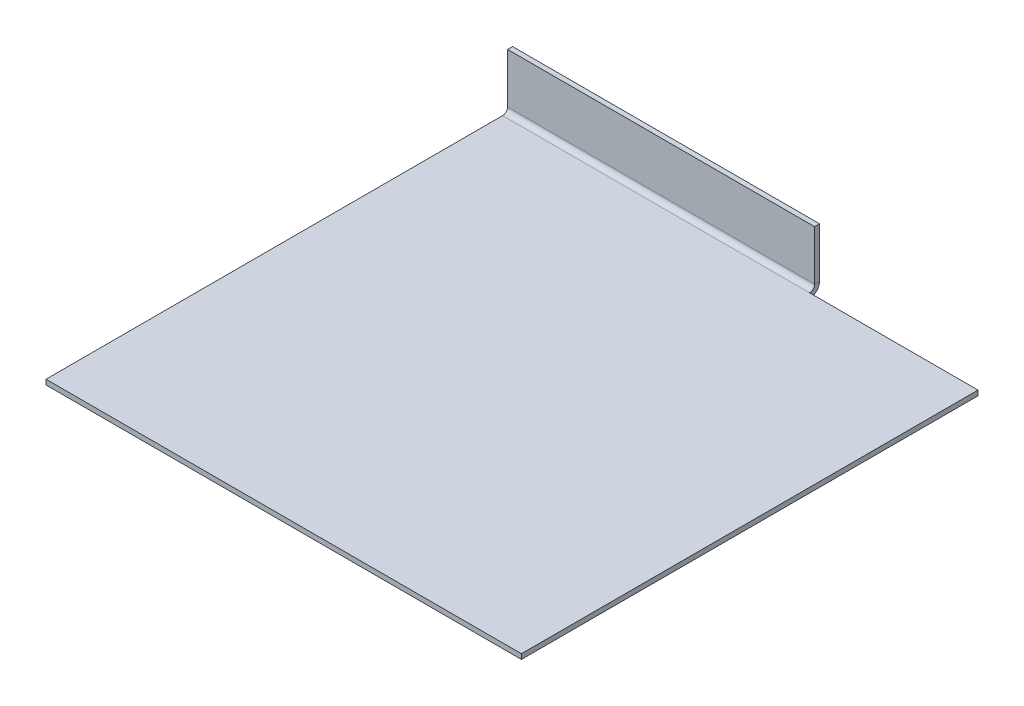
ISO-10303-21;
HEADER;
FILE_DESCRIPTION(('STEP AP214'),'2;1');
FILE_NAME('part.step','',(''),(''),'','','');
FILE_SCHEMA(('AUTOMOTIVE_DESIGN { 1 0 10303 214 1 1 1 1 }'));
ENDSEC;
DATA;
#1=APPLICATION_CONTEXT('core data for automotive mechanical design processes');
#2=APPLICATION_PROTOCOL_DEFINITION('international standard','automotive_design',2000,#1);
#3=PRODUCT_CONTEXT('',#1,'mechanical');
#4=PRODUCT('Part','Part','',(#3));
#5=PRODUCT_RELATED_PRODUCT_CATEGORY('part','',(#4));
#6=PRODUCT_DEFINITION_FORMATION('','',#4);
#7=PRODUCT_DEFINITION_CONTEXT('part definition',#1,'design');
#8=PRODUCT_DEFINITION('design','',#6,#7);
#9=PRODUCT_DEFINITION_SHAPE('','',#8);
#10=(LENGTH_UNIT() NAMED_UNIT(*) SI_UNIT(.MILLI.,.METRE.));
#11=(NAMED_UNIT(*) PLANE_ANGLE_UNIT() SI_UNIT($,.RADIAN.));
#12=(NAMED_UNIT(*) SI_UNIT($,.STERADIAN.) SOLID_ANGLE_UNIT());
#13=UNCERTAINTY_MEASURE_WITH_UNIT(LENGTH_MEASURE(1.E-05),#10,'distance_accuracy_value','');
#14=(GEOMETRIC_REPRESENTATION_CONTEXT(3) GLOBAL_UNCERTAINTY_ASSIGNED_CONTEXT((#13)) GLOBAL_UNIT_ASSIGNED_CONTEXT((#10,
#11,#12)) REPRESENTATION_CONTEXT('',''));
#15=CARTESIAN_POINT('',(0.,0.,0.));
#16=DIRECTION('',(0.,0.,1.));
#17=DIRECTION('',(1.,0.,0.));
#18=AXIS2_PLACEMENT_3D('',#15,#16,#17);
#19=CARTESIAN_POINT('',(-101.6,-3.175,-290.83));
#20=DIRECTION('',(-1.,0.,0.));
#21=DIRECTION('',(0.,0.,1.));
#22=AXIS2_PLACEMENT_3D('',#19,#20,#21);
#23=PLANE('',#22);
#24=DIRECTION('',(0.,0.,1.));
#25=VECTOR('',#24,1.);
#26=CARTESIAN_POINT('',(-101.6,0.,-290.83));
#27=LINE('',#26,#25);
#28=CARTESIAN_POINT('',(-101.6,0.,-290.83));
#29=VERTEX_POINT('',#28);
#30=CARTESIAN_POINT('',(-101.6,0.,0.));
#31=VERTEX_POINT('',#30);
#32=EDGE_CURVE('E196',#29,#31,#27,.T.);
#33=ORIENTED_EDGE('',*,*,#32,.F.);
#34=DIRECTION('',(0.,1.,0.));
#35=VECTOR('',#34,1.);
#36=CARTESIAN_POINT('',(-101.6,-3.175,-290.83));
#37=LINE('',#36,#35);
#38=CARTESIAN_POINT('',(-101.6,-3.175,-290.83));
#39=VERTEX_POINT('',#38);
#40=EDGE_CURVE('E67',#39,#29,#37,.T.);
#41=ORIENTED_EDGE('',*,*,#40,.F.);
#42=DIRECTION('',(0.,0.,1.));
#43=VECTOR('',#42,1.);
#44=CARTESIAN_POINT('',(-101.6,-3.175,-290.83));
#45=LINE('',#44,#43);
#46=CARTESIAN_POINT('',(-101.6,-3.175,0.));
#47=VERTEX_POINT('',#46);
#48=EDGE_CURVE('E201',#39,#47,#45,.T.);
#49=ORIENTED_EDGE('',*,*,#48,.T.);
#50=DIRECTION('',(0.,1.,0.));
#51=VECTOR('',#50,1.);
#52=CARTESIAN_POINT('',(-101.6,-3.175,0.));
#53=LINE('',#52,#51);
#54=EDGE_CURVE('E13',#47,#31,#53,.T.);
#55=ORIENTED_EDGE('',*,*,#54,.T.);
#56=EDGE_LOOP('',(#33,#41,#49,#55));
#57=FACE_BOUND('',#56,.T.);
#58=ADVANCED_FACE('F58',(#57),#23,.T.);
#59=CARTESIAN_POINT('',(0.,-3.175,-290.83));
#60=DIRECTION('',(0.,0.,-1.));
#61=DIRECTION('',(-1.,0.,0.));
#62=AXIS2_PLACEMENT_3D('',#59,#60,#61);
#63=PLANE('',#62);
#64=DIRECTION('',(0.,-1.,0.));
#65=VECTOR('',#64,1.);
#66=CARTESIAN_POINT('',(93.921520056,0.,-290.83));
#67=LINE('',#66,#65);
#68=CARTESIAN_POINT('',(93.921520056,0.,-290.83));
#69=VERTEX_POINT('',#68);
#70=CARTESIAN_POINT('',(93.921520056,-3.17500000000002,-290.83));
#71=VERTEX_POINT('',#70);
#72=EDGE_CURVE('E75',#69,#71,#67,.T.);
#73=ORIENTED_EDGE('',*,*,#72,.F.);
#74=DIRECTION('',(-1.,0.,0.));
#75=VECTOR('',#74,1.);
#76=CARTESIAN_POINT('',(0.,0.,-290.83));
#77=LINE('',#76,#75);
#78=CARTESIAN_POINT('',(201.20864,0.,-290.83));
#79=VERTEX_POINT('',#78);
#80=EDGE_CURVE('E208',#79,#69,#77,.T.);
#81=ORIENTED_EDGE('',*,*,#80,.F.);
#82=DIRECTION('',(0.,1.,0.));
#83=VECTOR('',#82,1.);
#84=CARTESIAN_POINT('',(201.20864,-3.175,-290.83));
#85=LINE('',#84,#83);
#86=CARTESIAN_POINT('',(201.20864,-3.175,-290.83));
#87=VERTEX_POINT('',#86);
#88=EDGE_CURVE('E213',#87,#79,#85,.T.);
#89=ORIENTED_EDGE('',*,*,#88,.F.);
#90=DIRECTION('',(-1.,0.,0.));
#91=VECTOR('',#90,1.);
#92=CARTESIAN_POINT('',(0.,-3.175,-290.83));
#93=LINE('',#92,#91);
#94=EDGE_CURVE('E199',#87,#71,#93,.T.);
#95=ORIENTED_EDGE('',*,*,#94,.T.);
#96=EDGE_LOOP('',(#73,#81,#89,#95));
#97=FACE_BOUND('',#96,.T.);
#98=ADVANCED_FACE('F254',(#97),#63,.T.);
#99=CARTESIAN_POINT('',(201.20864,-3.175,0.));
#100=DIRECTION('',(1.,0.,0.));
#101=DIRECTION('',(0.,0.,-1.));
#102=AXIS2_PLACEMENT_3D('',#99,#100,#101);
#103=PLANE('',#102);
#104=DIRECTION('',(0.,0.,-1.));
#105=VECTOR('',#104,1.);
#106=CARTESIAN_POINT('',(201.20864,0.,0.));
#107=LINE('',#106,#105);
#108=CARTESIAN_POINT('',(201.20864,0.,0.));
#109=VERTEX_POINT('',#108);
#110=EDGE_CURVE('E205',#109,#79,#107,.T.);
#111=ORIENTED_EDGE('',*,*,#110,.F.);
#112=DIRECTION('',(0.,1.,0.));
#113=VECTOR('',#112,1.);
#114=CARTESIAN_POINT('',(201.20864,-3.175,0.));
#115=LINE('',#114,#113);
#116=CARTESIAN_POINT('',(201.20864,-3.175,0.));
#117=VERTEX_POINT('',#116);
#118=EDGE_CURVE('E62',#117,#109,#115,.T.);
#119=ORIENTED_EDGE('',*,*,#118,.F.);
#120=DIRECTION('',(0.,0.,-1.));
#121=VECTOR('',#120,1.);
#122=CARTESIAN_POINT('',(201.20864,-3.175,0.));
#123=LINE('',#122,#121);
#124=EDGE_CURVE('E195',#117,#87,#123,.T.);
#125=ORIENTED_EDGE('',*,*,#124,.T.);
#126=ORIENTED_EDGE('',*,*,#88,.T.);
#127=EDGE_LOOP('',(#111,#119,#125,#126));
#128=FACE_BOUND('',#127,.T.);
#129=ADVANCED_FACE('F218',(#128),#103,.T.);
#130=CARTESIAN_POINT('',(0.,-3.175,0.));
#131=DIRECTION('',(0.,0.,1.));
#132=DIRECTION('',(1.,0.,0.));
#133=AXIS2_PLACEMENT_3D('',#130,#131,#132);
#134=PLANE('',#133);
#135=DIRECTION('',(1.,0.,0.));
#136=VECTOR('',#135,1.);
#137=CARTESIAN_POINT('',(0.,0.,0.));
#138=LINE('',#137,#136);
#139=EDGE_CURVE('E100',#31,#109,#138,.T.);
#140=ORIENTED_EDGE('',*,*,#139,.F.);
#141=ORIENTED_EDGE('',*,*,#54,.F.);
#142=DIRECTION('',(1.,0.,0.));
#143=VECTOR('',#142,1.);
#144=CARTESIAN_POINT('',(-101.6,-3.175,0.));
#145=LINE('',#144,#143);
#146=EDGE_CURVE('E102',#47,#117,#145,.T.);
#147=ORIENTED_EDGE('',*,*,#146,.T.);
#148=ORIENTED_EDGE('',*,*,#118,.T.);
#149=EDGE_LOOP('',(#140,#141,#147,#148));
#150=FACE_BOUND('',#149,.T.);
#151=ADVANCED_FACE('F60',(#150),#134,.T.);
#152=CARTESIAN_POINT('',(0.,-3.175,0.));
#153=DIRECTION('',(0.,1.,0.));
#154=DIRECTION('',(0.,0.,1.));
#155=AXIS2_PLACEMENT_3D('',#152,#153,#154);
#156=PLANE('',#155);
#157=ORIENTED_EDGE('',*,*,#146,.F.);
#158=ORIENTED_EDGE('',*,*,#48,.F.);
#159=DIRECTION('',(-1.,0.,0.));
#160=VECTOR('',#159,1.);
#161=CARTESIAN_POINT('',(-101.6,-3.17500000000002,-290.83));
#162=LINE('',#161,#160);
#163=EDGE_CURVE('E175',#39,#71,#162,.F.);
#164=ORIENTED_EDGE('',*,*,#163,.T.);
#165=ORIENTED_EDGE('',*,*,#94,.F.);
#166=ORIENTED_EDGE('',*,*,#124,.F.);
#167=EDGE_LOOP('',(#157,#158,#164,#165,#166));
#168=FACE_BOUND('',#167,.T.);
#169=ADVANCED_FACE('F250',(#168),#156,.F.);
#170=CARTESIAN_POINT('',(0.,0.,0.));
#171=DIRECTION('',(0.,1.,0.));
#172=DIRECTION('',(0.,0.,1.));
#173=AXIS2_PLACEMENT_3D('',#170,#171,#172);
#174=PLANE('',#173);
#175=ORIENTED_EDGE('',*,*,#32,.T.);
#176=ORIENTED_EDGE('',*,*,#139,.T.);
#177=ORIENTED_EDGE('',*,*,#110,.T.);
#178=ORIENTED_EDGE('',*,*,#80,.T.);
#179=DIRECTION('',(-1.,0.,0.));
#180=VECTOR('',#179,1.);
#181=CARTESIAN_POINT('',(-101.6,0.,-290.83));
#182=LINE('',#181,#180);
#183=EDGE_CURVE('E187',#29,#69,#182,.F.);
#184=ORIENTED_EDGE('',*,*,#183,.F.);
#185=EDGE_LOOP('',(#175,#176,#177,#178,#184));
#186=FACE_BOUND('',#185,.T.);
#187=ADVANCED_FACE('F220',(#186),#174,.T.);
#188=CARTESIAN_POINT('',(93.921520056,3.17499999999996,-290.83));
#189=DIRECTION('',(1.,0.,0.));
#190=DIRECTION('',(0.,0.,-1.));
#191=AXIS2_PLACEMENT_3D('',#188,#189,#190);
#192=PLANE('',#191);
#193=DIRECTION('',(0.,0.,1.));
#194=VECTOR('',#193,1.);
#195=CARTESIAN_POINT('',(93.921520056,3.175,-297.18));
#196=LINE('',#195,#194);
#197=CARTESIAN_POINT('',(93.921520056,3.17499999999995,-294.005));
#198=VERTEX_POINT('',#197);
#199=CARTESIAN_POINT('',(93.921520056,3.17499999999994,-297.18));
#200=VERTEX_POINT('',#199);
#201=EDGE_CURVE('E157',#198,#200,#196,.F.);
#202=ORIENTED_EDGE('',*,*,#201,.F.);
#203=CARTESIAN_POINT('',(93.921520056,3.17499999999996,-290.83));
#204=DIRECTION('',(-1.,0.,0.));
#205=DIRECTION('',(0.,0.,1.));
#206=AXIS2_PLACEMENT_3D('',#203,#204,#205);
#207=CIRCLE('',#206,3.17499999999998);
#208=EDGE_CURVE('E184',#69,#198,#207,.F.);
#209=ORIENTED_EDGE('',*,*,#208,.F.);
#210=ORIENTED_EDGE('',*,*,#72,.T.);
#211=CARTESIAN_POINT('',(93.921520056,3.17499999999996,-290.83));
#212=DIRECTION('',(-1.,0.,0.));
#213=DIRECTION('',(0.,0.,1.));
#214=AXIS2_PLACEMENT_3D('',#211,#212,#213);
#215=CIRCLE('',#214,6.34999999999998);
#216=EDGE_CURVE('E178',#71,#200,#215,.F.);
#217=ORIENTED_EDGE('',*,*,#216,.T.);
#218=EDGE_LOOP('',(#202,#209,#210,#217));
#219=FACE_BOUND('',#218,.T.);
#220=ADVANCED_FACE('F242',(#219),#192,.T.);
#221=CARTESIAN_POINT('',(-101.6,3.17499999999996,-290.83));
#222=DIRECTION('',(1.,0.,0.));
#223=DIRECTION('',(0.,0.,-1.));
#224=AXIS2_PLACEMENT_3D('',#221,#222,#223);
#225=PLANE('',#224);
#226=CARTESIAN_POINT('',(-101.6,3.17499999999996,-290.83));
#227=DIRECTION('',(-1.,0.,0.));
#228=DIRECTION('',(0.,0.,1.));
#229=AXIS2_PLACEMENT_3D('',#226,#227,#228);
#230=CIRCLE('',#229,3.17499999999998);
#231=CARTESIAN_POINT('',(-101.6,3.17499999999995,-294.005));
#232=VERTEX_POINT('',#231);
#233=EDGE_CURVE('E190',#232,#29,#230,.T.);
#234=ORIENTED_EDGE('',*,*,#233,.F.);
#235=DIRECTION('',(0.,0.,1.));
#236=VECTOR('',#235,1.);
#237=CARTESIAN_POINT('',(-101.6,3.17499999999998,-294.005));
#238=LINE('',#237,#236);
#239=CARTESIAN_POINT('',(-101.6,3.17500000000001,-297.18));
#240=VERTEX_POINT('',#239);
#241=EDGE_CURVE('E169',#232,#240,#238,.F.);
#242=ORIENTED_EDGE('',*,*,#241,.T.);
#243=CARTESIAN_POINT('',(-101.6,3.17499999999996,-290.83));
#244=DIRECTION('',(-1.,0.,0.));
#245=DIRECTION('',(0.,0.,1.));
#246=AXIS2_PLACEMENT_3D('',#243,#244,#245);
#247=CIRCLE('',#246,6.34999999999998);
#248=EDGE_CURVE('E179',#240,#39,#247,.T.);
#249=ORIENTED_EDGE('',*,*,#248,.T.);
#250=ORIENTED_EDGE('',*,*,#40,.T.);
#251=EDGE_LOOP('',(#234,#242,#249,#250));
#252=FACE_BOUND('',#251,.T.);
#253=ADVANCED_FACE('F226',(#252),#225,.F.);
#254=CARTESIAN_POINT('',(-101.6,3.17499999999996,-290.83));
#255=DIRECTION('',(-1.,0.,0.));
#256=DIRECTION('',(0.,0.,-1.));
#257=AXIS2_PLACEMENT_3D('',#254,#255,#256);
#258=CYLINDRICAL_SURFACE('',#257,6.34999999999998);
#259=ORIENTED_EDGE('',*,*,#163,.F.);
#260=ORIENTED_EDGE('',*,*,#248,.F.);
#261=DIRECTION('',(-1.,0.,0.));
#262=VECTOR('',#261,1.);
#263=CARTESIAN_POINT('',(93.921520056,3.17500000000001,-297.18));
#264=LINE('',#263,#262);
#265=EDGE_CURVE('E167',#240,#200,#264,.F.);
#266=ORIENTED_EDGE('',*,*,#265,.T.);
#267=ORIENTED_EDGE('',*,*,#216,.F.);
#268=EDGE_LOOP('',(#259,#260,#266,#267));
#269=FACE_BOUND('',#268,.T.);
#270=ADVANCED_FACE('F240',(#269),#258,.T.);
#271=CARTESIAN_POINT('',(-101.6,3.17499999999996,-290.83));
#272=DIRECTION('',(-1.,0.,0.));
#273=DIRECTION('',(0.,0.,-1.));
#274=AXIS2_PLACEMENT_3D('',#271,#272,#273);
#275=CYLINDRICAL_SURFACE('',#274,3.17499999999998);
#276=ORIENTED_EDGE('',*,*,#183,.T.);
#277=ORIENTED_EDGE('',*,*,#208,.T.);
#278=DIRECTION('',(-1.,0.,0.));
#279=VECTOR('',#278,1.);
#280=CARTESIAN_POINT('',(93.921520056,3.17499999999998,-294.005));
#281=LINE('',#280,#279);
#282=EDGE_CURVE('E172',#198,#232,#281,.T.);
#283=ORIENTED_EDGE('',*,*,#282,.T.);
#284=ORIENTED_EDGE('',*,*,#233,.T.);
#285=EDGE_LOOP('',(#276,#277,#283,#284));
#286=FACE_BOUND('',#285,.T.);
#287=ADVANCED_FACE('F229',(#286),#275,.F.);
#288=CARTESIAN_POINT('',(-101.6,34.925,-297.18));
#289=DIRECTION('',(1.,0.,0.));
#290=DIRECTION('',(0.,0.,-1.));
#291=AXIS2_PLACEMENT_3D('',#288,#289,#290);
#292=PLANE('',#291);
#293=ORIENTED_EDGE('',*,*,#241,.F.);
#294=DIRECTION('',(0.,-1.,0.));
#295=VECTOR('',#294,1.);
#296=CARTESIAN_POINT('',(-101.6,34.925,-294.005));
#297=LINE('',#296,#295);
#298=CARTESIAN_POINT('',(-101.6,34.925,-294.005));
#299=VERTEX_POINT('',#298);
#300=EDGE_CURVE('E165',#232,#299,#297,.F.);
#301=ORIENTED_EDGE('',*,*,#300,.T.);
#302=DIRECTION('',(0.,0.,1.));
#303=VECTOR('',#302,1.);
#304=CARTESIAN_POINT('',(-101.6,34.925,-297.18));
#305=LINE('',#304,#303);
#306=CARTESIAN_POINT('',(-101.6,34.925,-297.18));
#307=VERTEX_POINT('',#306);
#308=EDGE_CURVE('E153',#307,#299,#305,.T.);
#309=ORIENTED_EDGE('',*,*,#308,.F.);
#310=DIRECTION('',(0.,1.,0.));
#311=VECTOR('',#310,1.);
#312=CARTESIAN_POINT('',(-101.6,-9.35598444665957E-13,-297.18));
#313=LINE('',#312,#311);
#314=EDGE_CURVE('E140',#240,#307,#313,.T.);
#315=ORIENTED_EDGE('',*,*,#314,.F.);
#316=EDGE_LOOP('',(#293,#301,#309,#315));
#317=FACE_BOUND('',#316,.T.);
#318=ADVANCED_FACE('F236',(#317),#292,.F.);
#319=CARTESIAN_POINT('',(93.921520056,34.925,-297.18));
#320=DIRECTION('',(-1.,0.,0.));
#321=DIRECTION('',(0.,0.,1.));
#322=AXIS2_PLACEMENT_3D('',#319,#320,#321);
#323=PLANE('',#322);
#324=ORIENTED_EDGE('',*,*,#201,.T.);
#325=DIRECTION('',(0.,-1.,0.));
#326=VECTOR('',#325,1.);
#327=CARTESIAN_POINT('',(93.921520056,-9.35598444665957E-13,-297.18));
#328=LINE('',#327,#326);
#329=CARTESIAN_POINT('',(93.921520056,34.925,-297.18));
#330=VERTEX_POINT('',#329);
#331=EDGE_CURVE('E138',#330,#200,#328,.T.);
#332=ORIENTED_EDGE('',*,*,#331,.F.);
#333=DIRECTION('',(0.,0.,1.));
#334=VECTOR('',#333,1.);
#335=CARTESIAN_POINT('',(93.921520056,34.925,-297.18));
#336=LINE('',#335,#334);
#337=CARTESIAN_POINT('',(93.921520056,34.925,-294.005));
#338=VERTEX_POINT('',#337);
#339=EDGE_CURVE('E146',#330,#338,#336,.T.);
#340=ORIENTED_EDGE('',*,*,#339,.T.);
#341=DIRECTION('',(0.,1.,0.));
#342=VECTOR('',#341,1.);
#343=CARTESIAN_POINT('',(93.921520056,34.925,-294.005));
#344=LINE('',#343,#342);
#345=EDGE_CURVE('E162',#338,#198,#344,.F.);
#346=ORIENTED_EDGE('',*,*,#345,.T.);
#347=EDGE_LOOP('',(#324,#332,#340,#346));
#348=FACE_BOUND('',#347,.T.);
#349=ADVANCED_FACE('F156',(#348),#323,.F.);
#350=CARTESIAN_POINT('',(0.,-9.35598444665957E-13,-297.18));
#351=DIRECTION('',(0.,0.,1.));
#352=DIRECTION('',(0.,-1.,0.));
#353=AXIS2_PLACEMENT_3D('',#350,#351,#352);
#354=PLANE('',#353);
#355=ORIENTED_EDGE('',*,*,#265,.F.);
#356=ORIENTED_EDGE('',*,*,#314,.T.);
#357=DIRECTION('',(1.,0.,0.));
#358=VECTOR('',#357,1.);
#359=CARTESIAN_POINT('',(0.,34.925,-297.18));
#360=LINE('',#359,#358);
#361=EDGE_CURVE('E133',#307,#330,#360,.T.);
#362=ORIENTED_EDGE('',*,*,#361,.T.);
#363=ORIENTED_EDGE('',*,*,#331,.T.);
#364=EDGE_LOOP('',(#355,#356,#362,#363));
#365=FACE_BOUND('',#364,.T.);
#366=ADVANCED_FACE('F136',(#365),#354,.F.);
#367=CARTESIAN_POINT('',(0.,-9.2451299141513E-13,-294.005));
#368=DIRECTION('',(0.,0.,1.));
#369=DIRECTION('',(0.,-1.,0.));
#370=AXIS2_PLACEMENT_3D('',#367,#368,#369);
#371=PLANE('',#370);
#372=ORIENTED_EDGE('',*,*,#300,.F.);
#373=ORIENTED_EDGE('',*,*,#282,.F.);
#374=ORIENTED_EDGE('',*,*,#345,.F.);
#375=DIRECTION('',(-1.,0.,0.));
#376=VECTOR('',#375,1.);
#377=CARTESIAN_POINT('',(93.921520056,34.925,-294.005));
#378=LINE('',#377,#376);
#379=EDGE_CURVE('E149',#299,#338,#378,.F.);
#380=ORIENTED_EDGE('',*,*,#379,.F.);
#381=EDGE_LOOP('',(#372,#373,#374,#380));
#382=FACE_BOUND('',#381,.T.);
#383=ADVANCED_FACE('F234',(#382),#371,.T.);
#384=CARTESIAN_POINT('',(93.921520056,34.925,-297.18));
#385=DIRECTION('',(0.,-1.,0.));
#386=DIRECTION('',(0.,0.,-1.));
#387=AXIS2_PLACEMENT_3D('',#384,#385,#386);
#388=PLANE('',#387);
#389=ORIENTED_EDGE('',*,*,#379,.T.);
#390=ORIENTED_EDGE('',*,*,#339,.F.);
#391=ORIENTED_EDGE('',*,*,#361,.F.);
#392=ORIENTED_EDGE('',*,*,#308,.T.);
#393=EDGE_LOOP('',(#389,#390,#391,#392));
#394=FACE_BOUND('',#393,.T.);
#395=ADVANCED_FACE('F147',(#394),#388,.F.);
#396=CLOSED_SHELL('',(#58,#98,#129,#151,#169,#187,#220,#253,#270,#287,#318,#349,#366,#383,#395));
#397=MANIFOLD_SOLID_BREP('B2',#396);
#398=ADVANCED_BREP_SHAPE_REPRESENTATION('',(#18,#397),#14);
#399=SHAPE_DEFINITION_REPRESENTATION(#9,#398);
ENDSEC;
END-ISO-10303-21;
